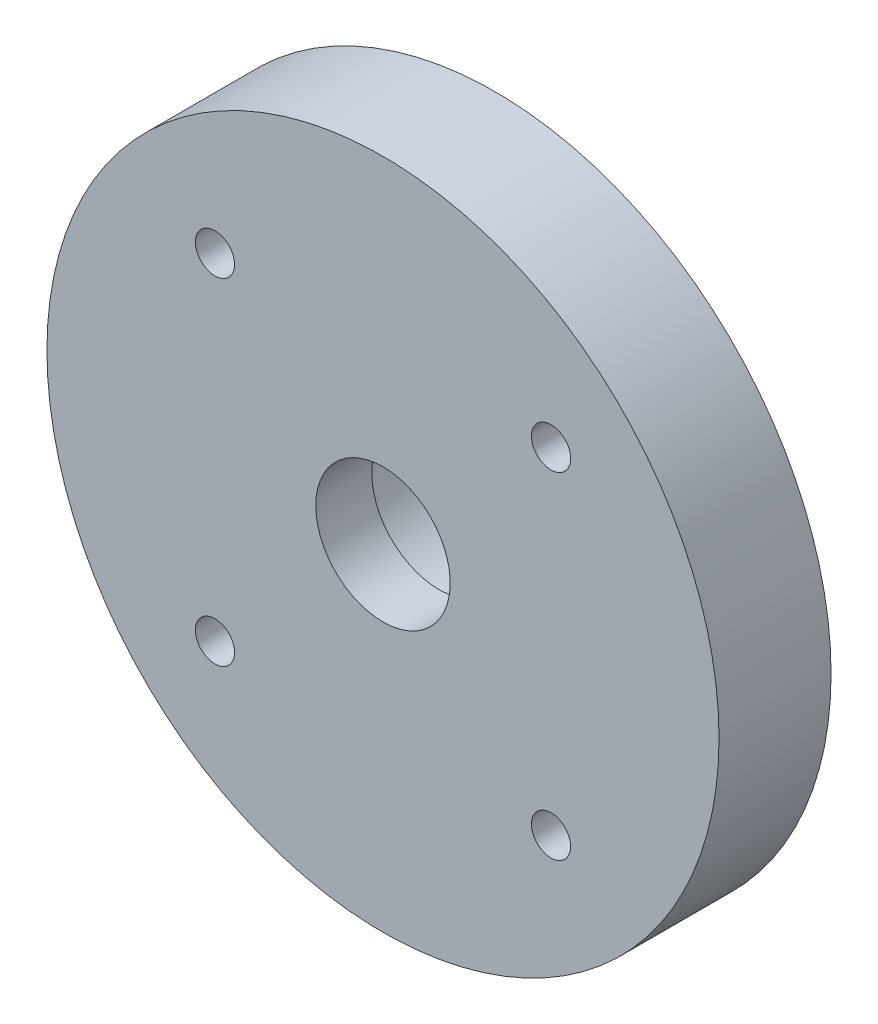
ISO-10303-21;
HEADER;
FILE_DESCRIPTION(('STEP AP214'),'2;1');
FILE_NAME('part.step','',(''),(''),'','','');
FILE_SCHEMA(('AUTOMOTIVE_DESIGN { 1 0 10303 214 1 1 1 1 }'));
ENDSEC;
DATA;
#1=APPLICATION_CONTEXT('core data for automotive mechanical design processes');
#2=APPLICATION_PROTOCOL_DEFINITION('international standard','automotive_design',2000,#1);
#3=PRODUCT_CONTEXT('',#1,'mechanical');
#4=PRODUCT('Part','Part','',(#3));
#5=PRODUCT_RELATED_PRODUCT_CATEGORY('part','',(#4));
#6=PRODUCT_DEFINITION_FORMATION('','',#4);
#7=PRODUCT_DEFINITION_CONTEXT('part definition',#1,'design');
#8=PRODUCT_DEFINITION('design','',#6,#7);
#9=PRODUCT_DEFINITION_SHAPE('','',#8);
#10=(LENGTH_UNIT() NAMED_UNIT(*) SI_UNIT(.MILLI.,.METRE.));
#11=(NAMED_UNIT(*) PLANE_ANGLE_UNIT() SI_UNIT($,.RADIAN.));
#12=(NAMED_UNIT(*) SI_UNIT($,.STERADIAN.) SOLID_ANGLE_UNIT());
#13=UNCERTAINTY_MEASURE_WITH_UNIT(LENGTH_MEASURE(1.E-05),#10,'distance_accuracy_value','');
#14=(GEOMETRIC_REPRESENTATION_CONTEXT(3) GLOBAL_UNCERTAINTY_ASSIGNED_CONTEXT((#13)) GLOBAL_UNIT_ASSIGNED_CONTEXT((#10,
#11,#12)) REPRESENTATION_CONTEXT('',''));
#15=CARTESIAN_POINT('',(0.,0.,0.));
#16=DIRECTION('',(0.,0.,1.));
#17=DIRECTION('',(1.,0.,0.));
#18=AXIS2_PLACEMENT_3D('',#15,#16,#17);
#19=CARTESIAN_POINT('',(-15.,-15.,10.));
#20=DIRECTION('',(0.,0.,-1.));
#21=DIRECTION('',(-1.,0.,0.));
#22=AXIS2_PLACEMENT_3D('',#19,#20,#21);
#23=CYLINDRICAL_SURFACE('',#22,1.75);
#24=CARTESIAN_POINT('',(-15.,-15.,10.));
#25=DIRECTION('',(0.,0.,-1.));
#26=DIRECTION('',(-1.,0.,0.));
#27=AXIS2_PLACEMENT_3D('',#24,#25,#26);
#28=CIRCLE('',#27,1.75);
#29=CARTESIAN_POINT('',(-16.75,-15.,10.));
#30=VERTEX_POINT('',#29);
#31=EDGE_CURVE('E399',#30,#30,#28,.T.);
#32=ORIENTED_EDGE('',*,*,#31,.F.);
#33=EDGE_LOOP('',(#32));
#34=FACE_BOUND('',#33,.T.);
#35=CARTESIAN_POINT('',(-15.,-15.,2.));
#36=DIRECTION('',(0.,0.,-1.));
#37=DIRECTION('',(-1.,0.,0.));
#38=AXIS2_PLACEMENT_3D('',#35,#36,#37);
#39=CIRCLE('',#38,1.75);
#40=CARTESIAN_POINT('',(-16.75,-15.,2.));
#41=VERTEX_POINT('',#40);
#42=EDGE_CURVE('E288',#41,#41,#39,.F.);
#43=ORIENTED_EDGE('',*,*,#42,.F.);
#44=EDGE_LOOP('',(#43));
#45=FACE_BOUND('',#44,.T.);
#46=ADVANCED_FACE('F33',(#34,#45),#23,.F.);
#47=CARTESIAN_POINT('',(15.,15.,10.));
#48=DIRECTION('',(0.,0.,-1.));
#49=DIRECTION('',(-1.,0.,0.));
#50=AXIS2_PLACEMENT_3D('',#47,#48,#49);
#51=CYLINDRICAL_SURFACE('',#50,1.75);
#52=CARTESIAN_POINT('',(15.,15.,10.));
#53=DIRECTION('',(0.,0.,-1.));
#54=DIRECTION('',(-1.,0.,0.));
#55=AXIS2_PLACEMENT_3D('',#52,#53,#54);
#56=CIRCLE('',#55,1.75);
#57=CARTESIAN_POINT('',(13.25,15.,10.));
#58=VERTEX_POINT('',#57);
#59=EDGE_CURVE('E405',#58,#58,#56,.T.);
#60=ORIENTED_EDGE('',*,*,#59,.F.);
#61=EDGE_LOOP('',(#60));
#62=FACE_BOUND('',#61,.T.);
#63=CARTESIAN_POINT('',(15.,15.,2.));
#64=DIRECTION('',(0.,0.,-1.));
#65=DIRECTION('',(-1.,0.,0.));
#66=AXIS2_PLACEMENT_3D('',#63,#64,#65);
#67=CIRCLE('',#66,1.75);
#68=CARTESIAN_POINT('',(13.25,15.,2.));
#69=VERTEX_POINT('',#68);
#70=EDGE_CURVE('E385',#69,#69,#67,.F.);
#71=ORIENTED_EDGE('',*,*,#70,.F.);
#72=EDGE_LOOP('',(#71));
#73=FACE_BOUND('',#72,.T.);
#74=ADVANCED_FACE('F431',(#62,#73),#51,.F.);
#75=CARTESIAN_POINT('',(0.,0.,10.));
#76=DIRECTION('',(0.,0.,-1.));
#77=DIRECTION('',(-1.,0.,0.));
#78=AXIS2_PLACEMENT_3D('',#75,#76,#77);
#79=CYLINDRICAL_SURFACE('',#78,6.);
#80=CARTESIAN_POINT('',(0.,0.,10.));
#81=DIRECTION('',(0.,0.,-1.));
#82=DIRECTION('',(-1.,0.,0.));
#83=AXIS2_PLACEMENT_3D('',#80,#81,#82);
#84=CIRCLE('',#83,6.);
#85=CARTESIAN_POINT('',(-6.,0.,10.));
#86=VERTEX_POINT('',#85);
#87=EDGE_CURVE('E415',#86,#86,#84,.T.);
#88=ORIENTED_EDGE('',*,*,#87,.F.);
#89=EDGE_LOOP('',(#88));
#90=FACE_BOUND('',#89,.T.);
#91=CARTESIAN_POINT('',(0.,0.,5.));
#92=DIRECTION('',(0.,0.,-1.));
#93=DIRECTION('',(-1.,0.,0.));
#94=AXIS2_PLACEMENT_3D('',#91,#92,#93);
#95=CIRCLE('',#94,6.);
#96=CARTESIAN_POINT('',(-6.,0.,5.));
#97=VERTEX_POINT('',#96);
#98=EDGE_CURVE('E412',#97,#97,#95,.F.);
#99=ORIENTED_EDGE('',*,*,#98,.F.);
#100=EDGE_LOOP('',(#99));
#101=FACE_BOUND('',#100,.T.);
#102=ADVANCED_FACE('F438',(#90,#101),#79,.F.);
#103=CARTESIAN_POINT('',(0.,0.,10.));
#104=DIRECTION('',(0.,0.,-1.));
#105=DIRECTION('',(-1.,0.,0.));
#106=AXIS2_PLACEMENT_3D('',#103,#104,#105);
#107=CYLINDRICAL_SURFACE('',#106,30.);
#108=CARTESIAN_POINT('',(0.,0.,10.));
#109=DIRECTION('',(0.,0.,1.));
#110=DIRECTION('',(1.,0.,0.));
#111=AXIS2_PLACEMENT_3D('',#108,#109,#110);
#112=CIRCLE('',#111,30.);
#113=CARTESIAN_POINT('',(30.,0.,10.));
#114=VERTEX_POINT('',#113);
#115=EDGE_CURVE('E11',#114,#114,#112,.T.);
#116=ORIENTED_EDGE('',*,*,#115,.F.);
#117=EDGE_LOOP('',(#116));
#118=FACE_BOUND('',#117,.T.);
#119=CARTESIAN_POINT('',(0.,0.,0.));
#120=DIRECTION('',(0.,0.,1.));
#121=DIRECTION('',(1.,0.,0.));
#122=AXIS2_PLACEMENT_3D('',#119,#120,#121);
#123=CIRCLE('',#122,30.);
#124=CARTESIAN_POINT('',(30.,0.,0.));
#125=VERTEX_POINT('',#124);
#126=EDGE_CURVE('E42',#125,#125,#123,.T.);
#127=ORIENTED_EDGE('',*,*,#126,.T.);
#128=EDGE_LOOP('',(#127));
#129=FACE_BOUND('',#128,.T.);
#130=ADVANCED_FACE('F35',(#118,#129),#107,.T.);
#131=CARTESIAN_POINT('',(0.,0.,10.));
#132=DIRECTION('',(0.,0.,1.));
#133=DIRECTION('',(1.,0.,0.));
#134=AXIS2_PLACEMENT_3D('',#131,#132,#133);
#135=PLANE('',#134);
#136=CARTESIAN_POINT('',(15.,-15.,10.));
#137=DIRECTION('',(0.,0.,-1.));
#138=DIRECTION('',(1.,0.,0.));
#139=AXIS2_PLACEMENT_3D('',#136,#137,#138);
#140=CIRCLE('',#139,1.75);
#141=CARTESIAN_POINT('',(16.75,-15.,10.));
#142=VERTEX_POINT('',#141);
#143=EDGE_CURVE('E396',#142,#142,#140,.T.);
#144=ORIENTED_EDGE('',*,*,#143,.T.);
#145=EDGE_LOOP('',(#144));
#146=FACE_BOUND('',#145,.T.);
#147=ORIENTED_EDGE('',*,*,#31,.T.);
#148=EDGE_LOOP('',(#147));
#149=FACE_BOUND('',#148,.T.);
#150=CARTESIAN_POINT('',(-15.,15.,10.));
#151=DIRECTION('',(0.,0.,-1.));
#152=DIRECTION('',(1.,0.,0.));
#153=AXIS2_PLACEMENT_3D('',#150,#151,#152);
#154=CIRCLE('',#153,1.75);
#155=CARTESIAN_POINT('',(-13.25,15.,10.));
#156=VERTEX_POINT('',#155);
#157=EDGE_CURVE('E402',#156,#156,#154,.T.);
#158=ORIENTED_EDGE('',*,*,#157,.T.);
#159=EDGE_LOOP('',(#158));
#160=FACE_BOUND('',#159,.T.);
#161=ORIENTED_EDGE('',*,*,#59,.T.);
#162=EDGE_LOOP('',(#161));
#163=FACE_BOUND('',#162,.T.);
#164=ORIENTED_EDGE('',*,*,#87,.T.);
#165=EDGE_LOOP('',(#164));
#166=FACE_BOUND('',#165,.T.);
#167=ORIENTED_EDGE('',*,*,#115,.T.);
#168=EDGE_LOOP('',(#167));
#169=FACE_BOUND('',#168,.T.);
#170=ADVANCED_FACE('F461',(#146,#149,#160,#163,#166,#169),#135,.T.);
#171=CARTESIAN_POINT('',(0.,0.,0.));
#172=DIRECTION('',(0.,0.,1.));
#173=DIRECTION('',(1.,0.,0.));
#174=AXIS2_PLACEMENT_3D('',#171,#172,#173);
#175=PLANE('',#174);
#176=DIRECTION('',(0.500000000000001,-0.866025403784438,0.));
#177=VECTOR('',#176,1.);
#178=CARTESIAN_POINT('',(18.2908965343809,-15.,0.));
#179=LINE('',#178,#177);
#180=CARTESIAN_POINT('',(16.6454482671904,-12.15,0.));
#181=VERTEX_POINT('',#180);
#182=CARTESIAN_POINT('',(18.2908965343809,-15.,0.));
#183=VERTEX_POINT('',#182);
#184=EDGE_CURVE('E232',#181,#183,#179,.T.);
#185=ORIENTED_EDGE('',*,*,#184,.F.);
#186=DIRECTION('',(1.,0.,0.));
#187=VECTOR('',#186,1.);
#188=CARTESIAN_POINT('',(16.6454482671904,-12.15,0.));
#189=LINE('',#188,#187);
#190=CARTESIAN_POINT('',(13.3545517328096,-12.15,0.));
#191=VERTEX_POINT('',#190);
#192=EDGE_CURVE('E50',#191,#181,#189,.T.);
#193=ORIENTED_EDGE('',*,*,#192,.F.);
#194=DIRECTION('',(0.499999999999999,0.866025403784439,0.));
#195=VECTOR('',#194,1.);
#196=CARTESIAN_POINT('',(13.3545517328096,-12.15,0.));
#197=LINE('',#196,#195);
#198=CARTESIAN_POINT('',(11.7091034656191,-15.,0.));
#199=VERTEX_POINT('',#198);
#200=EDGE_CURVE('E218',#199,#191,#197,.T.);
#201=ORIENTED_EDGE('',*,*,#200,.F.);
#202=DIRECTION('',(-0.5,0.866025403784439,0.));
#203=VECTOR('',#202,1.);
#204=CARTESIAN_POINT('',(11.7091034656191,-15.,0.));
#205=LINE('',#204,#203);
#206=CARTESIAN_POINT('',(13.3545517328096,-17.85,0.));
#207=VERTEX_POINT('',#206);
#208=EDGE_CURVE('E221',#207,#199,#205,.T.);
#209=ORIENTED_EDGE('',*,*,#208,.F.);
#210=DIRECTION('',(-1.,0.,0.));
#211=VECTOR('',#210,1.);
#212=CARTESIAN_POINT('',(13.3545517328096,-17.85,0.));
#213=LINE('',#212,#211);
#214=CARTESIAN_POINT('',(16.6454482671904,-17.85,0.));
#215=VERTEX_POINT('',#214);
#216=EDGE_CURVE('E237',#215,#207,#213,.T.);
#217=ORIENTED_EDGE('',*,*,#216,.F.);
#218=DIRECTION('',(-0.5,-0.866025403784439,0.));
#219=VECTOR('',#218,1.);
#220=CARTESIAN_POINT('',(16.6454482671904,-17.85,0.));
#221=LINE('',#220,#219);
#222=EDGE_CURVE('E234',#183,#215,#221,.T.);
#223=ORIENTED_EDGE('',*,*,#222,.F.);
#224=EDGE_LOOP('',(#185,#193,#201,#209,#217,#223));
#225=FACE_BOUND('',#224,.T.);
#226=DIRECTION('',(-0.5,-0.866025403784439,0.));
#227=VECTOR('',#226,1.);
#228=CARTESIAN_POINT('',(-11.7091034656191,-15.,0.));
#229=LINE('',#228,#227);
#230=CARTESIAN_POINT('',(-11.7091034656191,-15.,0.));
#231=VERTEX_POINT('',#230);
#232=CARTESIAN_POINT('',(-13.3545517328096,-17.85,0.));
#233=VERTEX_POINT('',#232);
#234=EDGE_CURVE('E272',#231,#233,#229,.T.);
#235=ORIENTED_EDGE('',*,*,#234,.F.);
#236=DIRECTION('',(0.499999999999999,-0.866025403784439,0.));
#237=VECTOR('',#236,1.);
#238=CARTESIAN_POINT('',(-13.3545517328096,-12.15,0.));
#239=LINE('',#238,#237);
#240=CARTESIAN_POINT('',(-13.3545517328096,-12.15,0.));
#241=VERTEX_POINT('',#240);
#242=EDGE_CURVE('E58',#241,#231,#239,.T.);
#243=ORIENTED_EDGE('',*,*,#242,.F.);
#244=DIRECTION('',(1.,0.,0.));
#245=VECTOR('',#244,1.);
#246=CARTESIAN_POINT('',(-16.6454482671904,-12.15,0.));
#247=LINE('',#246,#245);
#248=CARTESIAN_POINT('',(-16.6454482671904,-12.15,0.));
#249=VERTEX_POINT('',#248);
#250=EDGE_CURVE('E255',#249,#241,#247,.T.);
#251=ORIENTED_EDGE('',*,*,#250,.F.);
#252=DIRECTION('',(0.500000000000001,0.866025403784438,0.));
#253=VECTOR('',#252,1.);
#254=CARTESIAN_POINT('',(-18.2908965343809,-15.,0.));
#255=LINE('',#254,#253);
#256=CARTESIAN_POINT('',(-18.2908965343809,-15.,0.));
#257=VERTEX_POINT('',#256);
#258=EDGE_CURVE('E281',#257,#249,#255,.T.);
#259=ORIENTED_EDGE('',*,*,#258,.F.);
#260=DIRECTION('',(-0.5,0.866025403784439,0.));
#261=VECTOR('',#260,1.);
#262=CARTESIAN_POINT('',(-16.6454482671904,-17.85,0.));
#263=LINE('',#262,#261);
#264=CARTESIAN_POINT('',(-16.6454482671904,-17.85,0.));
#265=VERTEX_POINT('',#264);
#266=EDGE_CURVE('E278',#265,#257,#263,.T.);
#267=ORIENTED_EDGE('',*,*,#266,.F.);
#268=DIRECTION('',(-1.,0.,0.));
#269=VECTOR('',#268,1.);
#270=CARTESIAN_POINT('',(-13.3545517328096,-17.85,0.));
#271=LINE('',#270,#269);
#272=EDGE_CURVE('E275',#233,#265,#271,.T.);
#273=ORIENTED_EDGE('',*,*,#272,.F.);
#274=EDGE_LOOP('',(#235,#243,#251,#259,#267,#273));
#275=FACE_BOUND('',#274,.T.);
#276=DIRECTION('',(-0.500000000000001,0.866025403784438,0.));
#277=VECTOR('',#276,1.);
#278=CARTESIAN_POINT('',(-18.2908965343809,15.,0.));
#279=LINE('',#278,#277);
#280=CARTESIAN_POINT('',(-16.6454482671904,12.15,0.));
#281=VERTEX_POINT('',#280);
#282=CARTESIAN_POINT('',(-18.2908965343809,15.,0.));
#283=VERTEX_POINT('',#282);
#284=EDGE_CURVE('E320',#281,#283,#279,.T.);
#285=ORIENTED_EDGE('',*,*,#284,.F.);
#286=DIRECTION('',(-1.,0.,0.));
#287=VECTOR('',#286,1.);
#288=CARTESIAN_POINT('',(-16.6454482671904,12.15,0.));
#289=LINE('',#288,#287);
#290=CARTESIAN_POINT('',(-13.3545517328096,12.15,0.));
#291=VERTEX_POINT('',#290);
#292=EDGE_CURVE('E318',#291,#281,#289,.T.);
#293=ORIENTED_EDGE('',*,*,#292,.F.);
#294=DIRECTION('',(-0.499999999999999,-0.866025403784439,0.));
#295=VECTOR('',#294,1.);
#296=CARTESIAN_POINT('',(-13.3545517328096,12.15,0.));
#297=LINE('',#296,#295);
#298=CARTESIAN_POINT('',(-11.7091034656191,15.,0.));
#299=VERTEX_POINT('',#298);
#300=EDGE_CURVE('E302',#299,#291,#297,.T.);
#301=ORIENTED_EDGE('',*,*,#300,.F.);
#302=DIRECTION('',(0.5,-0.866025403784439,0.));
#303=VECTOR('',#302,1.);
#304=CARTESIAN_POINT('',(-11.7091034656191,15.,0.));
#305=LINE('',#304,#303);
#306=CARTESIAN_POINT('',(-13.3545517328096,17.85,0.));
#307=VERTEX_POINT('',#306);
#308=EDGE_CURVE('E329',#307,#299,#305,.T.);
#309=ORIENTED_EDGE('',*,*,#308,.F.);
#310=DIRECTION('',(1.,0.,0.));
#311=VECTOR('',#310,1.);
#312=CARTESIAN_POINT('',(-13.3545517328096,17.85,0.));
#313=LINE('',#312,#311);
#314=CARTESIAN_POINT('',(-16.6454482671904,17.85,0.));
#315=VERTEX_POINT('',#314);
#316=EDGE_CURVE('E326',#315,#307,#313,.T.);
#317=ORIENTED_EDGE('',*,*,#316,.F.);
#318=DIRECTION('',(0.5,0.866025403784439,0.));
#319=VECTOR('',#318,1.);
#320=CARTESIAN_POINT('',(-16.6454482671904,17.85,0.));
#321=LINE('',#320,#319);
#322=EDGE_CURVE('E323',#283,#315,#321,.T.);
#323=ORIENTED_EDGE('',*,*,#322,.F.);
#324=EDGE_LOOP('',(#285,#293,#301,#309,#317,#323));
#325=FACE_BOUND('',#324,.T.);
#326=DIRECTION('',(0.5,0.866025403784439,0.));
#327=VECTOR('',#326,1.);
#328=CARTESIAN_POINT('',(11.7091034656191,15.,0.));
#329=LINE('',#328,#327);
#330=CARTESIAN_POINT('',(11.7091034656191,15.,0.));
#331=VERTEX_POINT('',#330);
#332=CARTESIAN_POINT('',(13.3545517328096,17.85,0.));
#333=VERTEX_POINT('',#332);
#334=EDGE_CURVE('E369',#331,#333,#329,.T.);
#335=ORIENTED_EDGE('',*,*,#334,.F.);
#336=DIRECTION('',(-0.499999999999999,0.866025403784439,0.));
#337=VECTOR('',#336,1.);
#338=CARTESIAN_POINT('',(13.3545517328096,12.15,0.));
#339=LINE('',#338,#337);
#340=CARTESIAN_POINT('',(13.3545517328096,12.15,0.));
#341=VERTEX_POINT('',#340);
#342=EDGE_CURVE('E367',#341,#331,#339,.T.);
#343=ORIENTED_EDGE('',*,*,#342,.F.);
#344=DIRECTION('',(-1.,0.,0.));
#345=VECTOR('',#344,1.);
#346=CARTESIAN_POINT('',(16.6454482671904,12.15,0.));
#347=LINE('',#346,#345);
#348=CARTESIAN_POINT('',(16.6454482671904,12.15,0.));
#349=VERTEX_POINT('',#348);
#350=EDGE_CURVE('E351',#349,#341,#347,.T.);
#351=ORIENTED_EDGE('',*,*,#350,.F.);
#352=DIRECTION('',(-0.500000000000001,-0.866025403784438,0.));
#353=VECTOR('',#352,1.);
#354=CARTESIAN_POINT('',(18.2908965343809,15.,0.));
#355=LINE('',#354,#353);
#356=CARTESIAN_POINT('',(18.2908965343809,15.,0.));
#357=VERTEX_POINT('',#356);
#358=EDGE_CURVE('E378',#357,#349,#355,.T.);
#359=ORIENTED_EDGE('',*,*,#358,.F.);
#360=DIRECTION('',(0.5,-0.866025403784439,0.));
#361=VECTOR('',#360,1.);
#362=CARTESIAN_POINT('',(16.6454482671904,17.85,0.));
#363=LINE('',#362,#361);
#364=CARTESIAN_POINT('',(16.6454482671904,17.85,0.));
#365=VERTEX_POINT('',#364);
#366=EDGE_CURVE('E375',#365,#357,#363,.T.);
#367=ORIENTED_EDGE('',*,*,#366,.F.);
#368=DIRECTION('',(1.,0.,0.));
#369=VECTOR('',#368,1.);
#370=CARTESIAN_POINT('',(13.3545517328096,17.85,0.));
#371=LINE('',#370,#369);
#372=EDGE_CURVE('E372',#333,#365,#371,.T.);
#373=ORIENTED_EDGE('',*,*,#372,.F.);
#374=EDGE_LOOP('',(#335,#343,#351,#359,#367,#373));
#375=FACE_BOUND('',#374,.T.);
#376=CARTESIAN_POINT('',(0.,0.,0.));
#377=DIRECTION('',(0.,0.,-1.));
#378=DIRECTION('',(-1.,0.,0.));
#379=AXIS2_PLACEMENT_3D('',#376,#377,#378);
#380=CIRCLE('',#379,8.);
#381=CARTESIAN_POINT('',(-8.,0.,0.));
#382=VERTEX_POINT('',#381);
#383=EDGE_CURVE('E408',#382,#382,#380,.T.);
#384=ORIENTED_EDGE('',*,*,#383,.F.);
#385=EDGE_LOOP('',(#384));
#386=FACE_BOUND('',#385,.T.);
#387=ORIENTED_EDGE('',*,*,#126,.F.);
#388=EDGE_LOOP('',(#387));
#389=FACE_BOUND('',#388,.T.);
#390=ADVANCED_FACE('F454',(#225,#275,#325,#375,#386,#389),#175,.F.);
#391=CARTESIAN_POINT('',(0.,0.,5.));
#392=DIRECTION('',(0.,0.,-1.));
#393=DIRECTION('',(-1.,0.,0.));
#394=AXIS2_PLACEMENT_3D('',#391,#392,#393);
#395=PLANE('',#394);
#396=CARTESIAN_POINT('',(0.,0.,5.));
#397=DIRECTION('',(0.,0.,-1.));
#398=DIRECTION('',(-1.,0.,0.));
#399=AXIS2_PLACEMENT_3D('',#396,#397,#398);
#400=CIRCLE('',#399,8.);
#401=CARTESIAN_POINT('',(-8.,0.,5.));
#402=VERTEX_POINT('',#401);
#403=EDGE_CURVE('E409',#402,#402,#400,.T.);
#404=ORIENTED_EDGE('',*,*,#403,.T.);
#405=EDGE_LOOP('',(#404));
#406=FACE_BOUND('',#405,.T.);
#407=ORIENTED_EDGE('',*,*,#98,.T.);
#408=EDGE_LOOP('',(#407));
#409=FACE_BOUND('',#408,.T.);
#410=ADVANCED_FACE('F451',(#406,#409),#395,.T.);
#411=CARTESIAN_POINT('',(0.,0.,5.));
#412=DIRECTION('',(0.,0.,-1.));
#413=DIRECTION('',(-1.,0.,0.));
#414=AXIS2_PLACEMENT_3D('',#411,#412,#413);
#415=CYLINDRICAL_SURFACE('',#414,8.);
#416=ORIENTED_EDGE('',*,*,#403,.F.);
#417=EDGE_LOOP('',(#416));
#418=FACE_BOUND('',#417,.T.);
#419=ORIENTED_EDGE('',*,*,#383,.T.);
#420=EDGE_LOOP('',(#419));
#421=FACE_BOUND('',#420,.T.);
#422=ADVANCED_FACE('F448',(#418,#421),#415,.F.);
#423=CARTESIAN_POINT('',(-15.,15.,10.));
#424=DIRECTION('',(0.,0.,-1.));
#425=DIRECTION('',(-1.,0.,0.));
#426=AXIS2_PLACEMENT_3D('',#423,#424,#425);
#427=CYLINDRICAL_SURFACE('',#426,1.75);
#428=CARTESIAN_POINT('',(-15.,15.,2.));
#429=DIRECTION('',(0.,0.,1.));
#430=DIRECTION('',(1.,0.,0.));
#431=AXIS2_PLACEMENT_3D('',#428,#429,#430);
#432=CIRCLE('',#431,1.75);
#433=CARTESIAN_POINT('',(-13.25,15.,2.));
#434=VERTEX_POINT('',#433);
#435=EDGE_CURVE('E336',#434,#434,#432,.F.);
#436=ORIENTED_EDGE('',*,*,#435,.T.);
#437=EDGE_LOOP('',(#436));
#438=FACE_BOUND('',#437,.T.);
#439=ORIENTED_EDGE('',*,*,#157,.F.);
#440=EDGE_LOOP('',(#439));
#441=FACE_BOUND('',#440,.T.);
#442=ADVANCED_FACE('F446',(#438,#441),#427,.F.);
#443=CARTESIAN_POINT('',(15.,-15.,10.));
#444=DIRECTION('',(0.,0.,-1.));
#445=DIRECTION('',(-1.,0.,0.));
#446=AXIS2_PLACEMENT_3D('',#443,#444,#445);
#447=CYLINDRICAL_SURFACE('',#446,1.75);
#448=CARTESIAN_POINT('',(15.,-15.,2.));
#449=DIRECTION('',(0.,0.,1.));
#450=DIRECTION('',(1.,0.,0.));
#451=AXIS2_PLACEMENT_3D('',#448,#449,#450);
#452=CIRCLE('',#451,1.75);
#453=CARTESIAN_POINT('',(16.75,-15.,2.));
#454=VERTEX_POINT('',#453);
#455=EDGE_CURVE('E37',#454,#454,#452,.F.);
#456=ORIENTED_EDGE('',*,*,#455,.T.);
#457=EDGE_LOOP('',(#456));
#458=FACE_BOUND('',#457,.T.);
#459=ORIENTED_EDGE('',*,*,#143,.F.);
#460=EDGE_LOOP('',(#459));
#461=FACE_BOUND('',#460,.T.);
#462=ADVANCED_FACE('F444',(#458,#461),#447,.F.);
#463=CARTESIAN_POINT('',(0.,0.,2.));
#464=DIRECTION('',(0.,0.,-1.));
#465=DIRECTION('',(-1.,0.,0.));
#466=AXIS2_PLACEMENT_3D('',#463,#464,#465);
#467=PLANE('',#466);
#468=DIRECTION('',(-0.499999999999999,0.866025403784439,0.));
#469=VECTOR('',#468,1.);
#470=CARTESIAN_POINT('',(13.3545517328096,12.15,2.));
#471=LINE('',#470,#469);
#472=CARTESIAN_POINT('',(13.3545517328096,12.15,2.));
#473=VERTEX_POINT('',#472);
#474=CARTESIAN_POINT('',(11.7091034656191,15.,2.));
#475=VERTEX_POINT('',#474);
#476=EDGE_CURVE('E347',#473,#475,#471,.T.);
#477=ORIENTED_EDGE('',*,*,#476,.T.);
#478=DIRECTION('',(0.5,0.866025403784439,0.));
#479=VECTOR('',#478,1.);
#480=CARTESIAN_POINT('',(11.7091034656191,15.,2.));
#481=LINE('',#480,#479);
#482=CARTESIAN_POINT('',(13.3545517328096,17.85,2.));
#483=VERTEX_POINT('',#482);
#484=EDGE_CURVE('E350',#475,#483,#481,.T.);
#485=ORIENTED_EDGE('',*,*,#484,.T.);
#486=DIRECTION('',(1.,0.,0.));
#487=VECTOR('',#486,1.);
#488=CARTESIAN_POINT('',(13.3545517328096,17.85,2.));
#489=LINE('',#488,#487);
#490=CARTESIAN_POINT('',(16.6454482671904,17.85,2.));
#491=VERTEX_POINT('',#490);
#492=EDGE_CURVE('E354',#483,#491,#489,.T.);
#493=ORIENTED_EDGE('',*,*,#492,.T.);
#494=DIRECTION('',(0.5,-0.866025403784439,0.));
#495=VECTOR('',#494,1.);
#496=CARTESIAN_POINT('',(16.6454482671904,17.85,2.));
#497=LINE('',#496,#495);
#498=CARTESIAN_POINT('',(18.2908965343809,15.,2.));
#499=VERTEX_POINT('',#498);
#500=EDGE_CURVE('E357',#491,#499,#497,.T.);
#501=ORIENTED_EDGE('',*,*,#500,.T.);
#502=DIRECTION('',(-0.500000000000001,-0.866025403784438,0.));
#503=VECTOR('',#502,1.);
#504=CARTESIAN_POINT('',(18.2908965343809,15.,2.));
#505=LINE('',#504,#503);
#506=CARTESIAN_POINT('',(16.6454482671904,12.15,2.));
#507=VERTEX_POINT('',#506);
#508=EDGE_CURVE('E360',#499,#507,#505,.T.);
#509=ORIENTED_EDGE('',*,*,#508,.T.);
#510=DIRECTION('',(-1.,0.,0.));
#511=VECTOR('',#510,1.);
#512=CARTESIAN_POINT('',(16.6454482671904,12.15,2.));
#513=LINE('',#512,#511);
#514=EDGE_CURVE('E363',#507,#473,#513,.T.);
#515=ORIENTED_EDGE('',*,*,#514,.T.);
#516=EDGE_LOOP('',(#477,#485,#493,#501,#509,#515));
#517=FACE_BOUND('',#516,.T.);
#518=ORIENTED_EDGE('',*,*,#70,.T.);
#519=EDGE_LOOP('',(#518));
#520=FACE_BOUND('',#519,.T.);
#521=ADVANCED_FACE('F530',(#517,#520),#467,.T.);
#522=CARTESIAN_POINT('',(13.3545517328096,12.15,2.));
#523=DIRECTION('',(-0.866025403784439,-0.5,0.));
#524=DIRECTION('',(0.499999999999999,-0.866025403784439,0.));
#525=AXIS2_PLACEMENT_3D('',#522,#523,#524);
#526=PLANE('',#525);
#527=ORIENTED_EDGE('',*,*,#342,.T.);
#528=DIRECTION('',(0.,0.,-1.));
#529=VECTOR('',#528,1.);
#530=CARTESIAN_POINT('',(11.7091034656191,15.,2.));
#531=LINE('',#530,#529);
#532=EDGE_CURVE('E366',#475,#331,#531,.T.);
#533=ORIENTED_EDGE('',*,*,#532,.F.);
#534=ORIENTED_EDGE('',*,*,#476,.F.);
#535=DIRECTION('',(0.,0.,-1.));
#536=VECTOR('',#535,1.);
#537=CARTESIAN_POINT('',(13.3545517328096,12.15,2.));
#538=LINE('',#537,#536);
#539=EDGE_CURVE('E383',#473,#341,#538,.T.);
#540=ORIENTED_EDGE('',*,*,#539,.T.);
#541=EDGE_LOOP('',(#527,#533,#534,#540));
#542=FACE_BOUND('',#541,.T.);
#543=ADVANCED_FACE('F546',(#542),#526,.F.);
#544=CARTESIAN_POINT('',(16.6454482671904,12.15,2.));
#545=DIRECTION('',(0.,-1.,0.));
#546=DIRECTION('',(1.,0.,0.));
#547=AXIS2_PLACEMENT_3D('',#544,#545,#546);
#548=PLANE('',#547);
#549=ORIENTED_EDGE('',*,*,#350,.T.);
#550=ORIENTED_EDGE('',*,*,#539,.F.);
#551=ORIENTED_EDGE('',*,*,#514,.F.);
#552=DIRECTION('',(0.,0.,-1.));
#553=VECTOR('',#552,1.);
#554=CARTESIAN_POINT('',(16.6454482671904,12.15,2.));
#555=LINE('',#554,#553);
#556=EDGE_CURVE('E386',#507,#349,#555,.T.);
#557=ORIENTED_EDGE('',*,*,#556,.T.);
#558=EDGE_LOOP('',(#549,#550,#551,#557));
#559=FACE_BOUND('',#558,.T.);
#560=ADVANCED_FACE('F555',(#559),#548,.F.);
#561=CARTESIAN_POINT('',(18.2908965343809,15.,2.));
#562=DIRECTION('',(0.866025403784438,-0.500000000000001,0.));
#563=DIRECTION('',(0.500000000000001,0.866025403784438,0.));
#564=AXIS2_PLACEMENT_3D('',#561,#562,#563);
#565=PLANE('',#564);
#566=ORIENTED_EDGE('',*,*,#358,.T.);
#567=ORIENTED_EDGE('',*,*,#556,.F.);
#568=ORIENTED_EDGE('',*,*,#508,.F.);
#569=DIRECTION('',(0.,0.,-1.));
#570=VECTOR('',#569,1.);
#571=CARTESIAN_POINT('',(18.2908965343809,15.,2.));
#572=LINE('',#571,#570);
#573=EDGE_CURVE('E388',#499,#357,#572,.T.);
#574=ORIENTED_EDGE('',*,*,#573,.T.);
#575=EDGE_LOOP('',(#566,#567,#568,#574));
#576=FACE_BOUND('',#575,.T.);
#577=ADVANCED_FACE('F563',(#576),#565,.F.);
#578=CARTESIAN_POINT('',(16.6454482671904,17.85,2.));
#579=DIRECTION('',(0.866025403784439,0.5,0.));
#580=DIRECTION('',(-0.5,0.866025403784439,0.));
#581=AXIS2_PLACEMENT_3D('',#578,#579,#580);
#582=PLANE('',#581);
#583=ORIENTED_EDGE('',*,*,#366,.T.);
#584=ORIENTED_EDGE('',*,*,#573,.F.);
#585=ORIENTED_EDGE('',*,*,#500,.F.);
#586=DIRECTION('',(0.,0.,-1.));
#587=VECTOR('',#586,1.);
#588=CARTESIAN_POINT('',(16.6454482671904,17.85,2.));
#589=LINE('',#588,#587);
#590=EDGE_CURVE('E390',#491,#365,#589,.T.);
#591=ORIENTED_EDGE('',*,*,#590,.T.);
#592=EDGE_LOOP('',(#583,#584,#585,#591));
#593=FACE_BOUND('',#592,.T.);
#594=ADVANCED_FACE('F572',(#593),#582,.F.);
#595=CARTESIAN_POINT('',(13.3545517328096,17.85,2.));
#596=DIRECTION('',(0.,1.,0.));
#597=DIRECTION('',(0.,0.,1.));
#598=AXIS2_PLACEMENT_3D('',#595,#596,#597);
#599=PLANE('',#598);
#600=ORIENTED_EDGE('',*,*,#372,.T.);
#601=ORIENTED_EDGE('',*,*,#590,.F.);
#602=ORIENTED_EDGE('',*,*,#492,.F.);
#603=DIRECTION('',(0.,0.,-1.));
#604=VECTOR('',#603,1.);
#605=CARTESIAN_POINT('',(13.3545517328096,17.85,2.));
#606=LINE('',#605,#604);
#607=EDGE_CURVE('E392',#483,#333,#606,.T.);
#608=ORIENTED_EDGE('',*,*,#607,.T.);
#609=EDGE_LOOP('',(#600,#601,#602,#608));
#610=FACE_BOUND('',#609,.T.);
#611=ADVANCED_FACE('F581',(#610),#599,.F.);
#612=CARTESIAN_POINT('',(11.7091034656191,15.,2.));
#613=DIRECTION('',(-0.866025403784439,0.5,0.));
#614=DIRECTION('',(-0.5,-0.866025403784439,0.));
#615=AXIS2_PLACEMENT_3D('',#612,#613,#614);
#616=PLANE('',#615);
#617=ORIENTED_EDGE('',*,*,#334,.T.);
#618=ORIENTED_EDGE('',*,*,#607,.F.);
#619=ORIENTED_EDGE('',*,*,#484,.F.);
#620=ORIENTED_EDGE('',*,*,#532,.T.);
#621=EDGE_LOOP('',(#617,#618,#619,#620));
#622=FACE_BOUND('',#621,.T.);
#623=ADVANCED_FACE('F590',(#622),#616,.F.);
#624=CARTESIAN_POINT('',(0.,0.,2.));
#625=DIRECTION('',(0.,0.,1.));
#626=DIRECTION('',(1.,0.,0.));
#627=AXIS2_PLACEMENT_3D('',#624,#625,#626);
#628=PLANE('',#627);
#629=DIRECTION('',(-1.,0.,0.));
#630=VECTOR('',#629,1.);
#631=CARTESIAN_POINT('',(-16.6454482671904,12.15,2.));
#632=LINE('',#631,#630);
#633=CARTESIAN_POINT('',(-13.3545517328096,12.15,2.));
#634=VERTEX_POINT('',#633);
#635=CARTESIAN_POINT('',(-16.6454482671904,12.15,2.));
#636=VERTEX_POINT('',#635);
#637=EDGE_CURVE('E298',#634,#636,#632,.T.);
#638=ORIENTED_EDGE('',*,*,#637,.T.);
#639=DIRECTION('',(-0.500000000000001,0.866025403784438,0.));
#640=VECTOR('',#639,1.);
#641=CARTESIAN_POINT('',(-18.2908965343809,15.,2.));
#642=LINE('',#641,#640);
#643=CARTESIAN_POINT('',(-18.2908965343809,15.,2.));
#644=VERTEX_POINT('',#643);
#645=EDGE_CURVE('E301',#636,#644,#642,.T.);
#646=ORIENTED_EDGE('',*,*,#645,.T.);
#647=DIRECTION('',(0.5,0.866025403784439,0.));
#648=VECTOR('',#647,1.);
#649=CARTESIAN_POINT('',(-16.6454482671904,17.85,2.));
#650=LINE('',#649,#648);
#651=CARTESIAN_POINT('',(-16.6454482671904,17.85,2.));
#652=VERTEX_POINT('',#651);
#653=EDGE_CURVE('E305',#644,#652,#650,.T.);
#654=ORIENTED_EDGE('',*,*,#653,.T.);
#655=DIRECTION('',(1.,0.,0.));
#656=VECTOR('',#655,1.);
#657=CARTESIAN_POINT('',(-13.3545517328096,17.85,2.));
#658=LINE('',#657,#656);
#659=CARTESIAN_POINT('',(-13.3545517328096,17.85,2.));
#660=VERTEX_POINT('',#659);
#661=EDGE_CURVE('E308',#652,#660,#658,.T.);
#662=ORIENTED_EDGE('',*,*,#661,.T.);
#663=DIRECTION('',(0.5,-0.866025403784439,0.));
#664=VECTOR('',#663,1.);
#665=CARTESIAN_POINT('',(-11.7091034656191,15.,2.));
#666=LINE('',#665,#664);
#667=CARTESIAN_POINT('',(-11.7091034656191,15.,2.));
#668=VERTEX_POINT('',#667);
#669=EDGE_CURVE('E311',#660,#668,#666,.T.);
#670=ORIENTED_EDGE('',*,*,#669,.T.);
#671=DIRECTION('',(-0.499999999999999,-0.866025403784439,0.));
#672=VECTOR('',#671,1.);
#673=CARTESIAN_POINT('',(-13.3545517328096,12.15,2.));
#674=LINE('',#673,#672);
#675=EDGE_CURVE('E314',#668,#634,#674,.T.);
#676=ORIENTED_EDGE('',*,*,#675,.T.);
#677=EDGE_LOOP('',(#638,#646,#654,#662,#670,#676));
#678=FACE_BOUND('',#677,.T.);
#679=ORIENTED_EDGE('',*,*,#435,.F.);
#680=EDGE_LOOP('',(#679));
#681=FACE_BOUND('',#680,.T.);
#682=ADVANCED_FACE('F599',(#678,#681),#628,.F.);
#683=CARTESIAN_POINT('',(-16.6454482671904,12.15,2.));
#684=DIRECTION('',(0.,-1.,0.));
#685=DIRECTION('',(1.,0.,0.));
#686=AXIS2_PLACEMENT_3D('',#683,#684,#685);
#687=PLANE('',#686);
#688=ORIENTED_EDGE('',*,*,#292,.T.);
#689=DIRECTION('',(0.,0.,-1.));
#690=VECTOR('',#689,1.);
#691=CARTESIAN_POINT('',(-16.6454482671904,12.15,2.));
#692=LINE('',#691,#690);
#693=EDGE_CURVE('E317',#636,#281,#692,.T.);
#694=ORIENTED_EDGE('',*,*,#693,.F.);
#695=ORIENTED_EDGE('',*,*,#637,.F.);
#696=DIRECTION('',(0.,0.,-1.));
#697=VECTOR('',#696,1.);
#698=CARTESIAN_POINT('',(-13.3545517328096,12.15,2.));
#699=LINE('',#698,#697);
#700=EDGE_CURVE('E334',#634,#291,#699,.T.);
#701=ORIENTED_EDGE('',*,*,#700,.T.);
#702=EDGE_LOOP('',(#688,#694,#695,#701));
#703=FACE_BOUND('',#702,.T.);
#704=ADVANCED_FACE('F608',(#703),#687,.F.);
#705=CARTESIAN_POINT('',(-13.3545517328096,12.15,2.));
#706=DIRECTION('',(0.866025403784439,-0.5,0.));
#707=DIRECTION('',(0.499999999999999,0.866025403784439,0.));
#708=AXIS2_PLACEMENT_3D('',#705,#706,#707);
#709=PLANE('',#708);
#710=ORIENTED_EDGE('',*,*,#300,.T.);
#711=ORIENTED_EDGE('',*,*,#700,.F.);
#712=ORIENTED_EDGE('',*,*,#675,.F.);
#713=DIRECTION('',(0.,0.,-1.));
#714=VECTOR('',#713,1.);
#715=CARTESIAN_POINT('',(-11.7091034656191,15.,2.));
#716=LINE('',#715,#714);
#717=EDGE_CURVE('E337',#668,#299,#716,.T.);
#718=ORIENTED_EDGE('',*,*,#717,.T.);
#719=EDGE_LOOP('',(#710,#711,#712,#718));
#720=FACE_BOUND('',#719,.T.);
#721=ADVANCED_FACE('F617',(#720),#709,.F.);
#722=CARTESIAN_POINT('',(-11.7091034656191,15.,2.));
#723=DIRECTION('',(0.866025403784439,0.5,0.));
#724=DIRECTION('',(-0.5,0.866025403784439,0.));
#725=AXIS2_PLACEMENT_3D('',#722,#723,#724);
#726=PLANE('',#725);
#727=ORIENTED_EDGE('',*,*,#308,.T.);
#728=ORIENTED_EDGE('',*,*,#717,.F.);
#729=ORIENTED_EDGE('',*,*,#669,.F.);
#730=DIRECTION('',(0.,0.,-1.));
#731=VECTOR('',#730,1.);
#732=CARTESIAN_POINT('',(-13.3545517328096,17.85,2.));
#733=LINE('',#732,#731);
#734=EDGE_CURVE('E339',#660,#307,#733,.T.);
#735=ORIENTED_EDGE('',*,*,#734,.T.);
#736=EDGE_LOOP('',(#727,#728,#729,#735));
#737=FACE_BOUND('',#736,.T.);
#738=ADVANCED_FACE('F626',(#737),#726,.F.);
#739=CARTESIAN_POINT('',(-13.3545517328096,17.85,2.));
#740=DIRECTION('',(0.,1.,0.));
#741=DIRECTION('',(0.,0.,1.));
#742=AXIS2_PLACEMENT_3D('',#739,#740,#741);
#743=PLANE('',#742);
#744=ORIENTED_EDGE('',*,*,#316,.T.);
#745=ORIENTED_EDGE('',*,*,#734,.F.);
#746=ORIENTED_EDGE('',*,*,#661,.F.);
#747=DIRECTION('',(0.,0.,-1.));
#748=VECTOR('',#747,1.);
#749=CARTESIAN_POINT('',(-16.6454482671904,17.85,2.));
#750=LINE('',#749,#748);
#751=EDGE_CURVE('E341',#652,#315,#750,.T.);
#752=ORIENTED_EDGE('',*,*,#751,.T.);
#753=EDGE_LOOP('',(#744,#745,#746,#752));
#754=FACE_BOUND('',#753,.T.);
#755=ADVANCED_FACE('F635',(#754),#743,.F.);
#756=CARTESIAN_POINT('',(-16.6454482671904,17.85,2.));
#757=DIRECTION('',(-0.866025403784439,0.5,0.));
#758=DIRECTION('',(-0.5,-0.866025403784439,0.));
#759=AXIS2_PLACEMENT_3D('',#756,#757,#758);
#760=PLANE('',#759);
#761=ORIENTED_EDGE('',*,*,#322,.T.);
#762=ORIENTED_EDGE('',*,*,#751,.F.);
#763=ORIENTED_EDGE('',*,*,#653,.F.);
#764=DIRECTION('',(0.,0.,-1.));
#765=VECTOR('',#764,1.);
#766=CARTESIAN_POINT('',(-18.2908965343809,15.,2.));
#767=LINE('',#766,#765);
#768=EDGE_CURVE('E343',#644,#283,#767,.T.);
#769=ORIENTED_EDGE('',*,*,#768,.T.);
#770=EDGE_LOOP('',(#761,#762,#763,#769));
#771=FACE_BOUND('',#770,.T.);
#772=ADVANCED_FACE('F644',(#771),#760,.F.);
#773=CARTESIAN_POINT('',(-18.2908965343809,15.,2.));
#774=DIRECTION('',(-0.866025403784438,-0.500000000000001,0.));
#775=DIRECTION('',(0.500000000000001,-0.866025403784438,0.));
#776=AXIS2_PLACEMENT_3D('',#773,#774,#775);
#777=PLANE('',#776);
#778=ORIENTED_EDGE('',*,*,#284,.T.);
#779=ORIENTED_EDGE('',*,*,#768,.F.);
#780=ORIENTED_EDGE('',*,*,#645,.F.);
#781=ORIENTED_EDGE('',*,*,#693,.T.);
#782=EDGE_LOOP('',(#778,#779,#780,#781));
#783=FACE_BOUND('',#782,.T.);
#784=ADVANCED_FACE('F653',(#783),#777,.F.);
#785=CARTESIAN_POINT('',(0.,0.,2.));
#786=DIRECTION('',(0.,0.,-1.));
#787=DIRECTION('',(-1.,0.,0.));
#788=AXIS2_PLACEMENT_3D('',#785,#786,#787);
#789=PLANE('',#788);
#790=DIRECTION('',(0.499999999999999,-0.866025403784439,0.));
#791=VECTOR('',#790,1.);
#792=CARTESIAN_POINT('',(-13.3545517328096,-12.15,2.));
#793=LINE('',#792,#791);
#794=CARTESIAN_POINT('',(-13.3545517328096,-12.15,2.));
#795=VERTEX_POINT('',#794);
#796=CARTESIAN_POINT('',(-11.7091034656191,-15.,2.));
#797=VERTEX_POINT('',#796);
#798=EDGE_CURVE('E251',#795,#797,#793,.T.);
#799=ORIENTED_EDGE('',*,*,#798,.T.);
#800=DIRECTION('',(-0.5,-0.866025403784439,0.));
#801=VECTOR('',#800,1.);
#802=CARTESIAN_POINT('',(-11.7091034656191,-15.,2.));
#803=LINE('',#802,#801);
#804=CARTESIAN_POINT('',(-13.3545517328096,-17.85,2.));
#805=VERTEX_POINT('',#804);
#806=EDGE_CURVE('E254',#797,#805,#803,.T.);
#807=ORIENTED_EDGE('',*,*,#806,.T.);
#808=DIRECTION('',(-1.,0.,0.));
#809=VECTOR('',#808,1.);
#810=CARTESIAN_POINT('',(-13.3545517328096,-17.85,2.));
#811=LINE('',#810,#809);
#812=CARTESIAN_POINT('',(-16.6454482671904,-17.85,2.));
#813=VERTEX_POINT('',#812);
#814=EDGE_CURVE('E258',#805,#813,#811,.T.);
#815=ORIENTED_EDGE('',*,*,#814,.T.);
#816=DIRECTION('',(-0.5,0.866025403784439,0.));
#817=VECTOR('',#816,1.);
#818=CARTESIAN_POINT('',(-16.6454482671904,-17.85,2.));
#819=LINE('',#818,#817);
#820=CARTESIAN_POINT('',(-18.2908965343809,-15.,2.));
#821=VERTEX_POINT('',#820);
#822=EDGE_CURVE('E261',#813,#821,#819,.T.);
#823=ORIENTED_EDGE('',*,*,#822,.T.);
#824=DIRECTION('',(0.500000000000001,0.866025403784438,0.));
#825=VECTOR('',#824,1.);
#826=CARTESIAN_POINT('',(-18.2908965343809,-15.,2.));
#827=LINE('',#826,#825);
#828=CARTESIAN_POINT('',(-16.6454482671904,-12.15,2.));
#829=VERTEX_POINT('',#828);
#830=EDGE_CURVE('E264',#821,#829,#827,.T.);
#831=ORIENTED_EDGE('',*,*,#830,.T.);
#832=DIRECTION('',(1.,0.,0.));
#833=VECTOR('',#832,1.);
#834=CARTESIAN_POINT('',(-16.6454482671904,-12.15,2.));
#835=LINE('',#834,#833);
#836=EDGE_CURVE('E267',#829,#795,#835,.T.);
#837=ORIENTED_EDGE('',*,*,#836,.T.);
#838=EDGE_LOOP('',(#799,#807,#815,#823,#831,#837));
#839=FACE_BOUND('',#838,.T.);
#840=ORIENTED_EDGE('',*,*,#42,.T.);
#841=EDGE_LOOP('',(#840));
#842=FACE_BOUND('',#841,.T.);
#843=ADVANCED_FACE('F428',(#839,#842),#789,.T.);
#844=CARTESIAN_POINT('',(-13.3545517328096,-12.15,2.));
#845=DIRECTION('',(0.866025403784439,0.5,0.));
#846=DIRECTION('',(-0.499999999999999,0.866025403784439,0.));
#847=AXIS2_PLACEMENT_3D('',#844,#845,#846);
#848=PLANE('',#847);
#849=ORIENTED_EDGE('',*,*,#242,.T.);
#850=DIRECTION('',(0.,0.,-1.));
#851=VECTOR('',#850,1.);
#852=CARTESIAN_POINT('',(-11.7091034656191,-15.,2.));
#853=LINE('',#852,#851);
#854=EDGE_CURVE('E270',#797,#231,#853,.T.);
#855=ORIENTED_EDGE('',*,*,#854,.F.);
#856=ORIENTED_EDGE('',*,*,#798,.F.);
#857=DIRECTION('',(0.,0.,-1.));
#858=VECTOR('',#857,1.);
#859=CARTESIAN_POINT('',(-13.3545517328096,-12.15,2.));
#860=LINE('',#859,#858);
#861=EDGE_CURVE('E286',#795,#241,#860,.T.);
#862=ORIENTED_EDGE('',*,*,#861,.T.);
#863=EDGE_LOOP('',(#849,#855,#856,#862));
#864=FACE_BOUND('',#863,.T.);
#865=ADVANCED_FACE('F670',(#864),#848,.F.);
#866=CARTESIAN_POINT('',(-16.6454482671904,-12.15,2.));
#867=DIRECTION('',(0.,1.,0.));
#868=DIRECTION('',(-1.,0.,0.));
#869=AXIS2_PLACEMENT_3D('',#866,#867,#868);
#870=PLANE('',#869);
#871=ORIENTED_EDGE('',*,*,#250,.T.);
#872=ORIENTED_EDGE('',*,*,#861,.F.);
#873=ORIENTED_EDGE('',*,*,#836,.F.);
#874=DIRECTION('',(0.,0.,-1.));
#875=VECTOR('',#874,1.);
#876=CARTESIAN_POINT('',(-16.6454482671904,-12.15,2.));
#877=LINE('',#876,#875);
#878=EDGE_CURVE('E289',#829,#249,#877,.T.);
#879=ORIENTED_EDGE('',*,*,#878,.T.);
#880=EDGE_LOOP('',(#871,#872,#873,#879));
#881=FACE_BOUND('',#880,.T.);
#882=ADVANCED_FACE('F679',(#881),#870,.F.);
#883=CARTESIAN_POINT('',(-18.2908965343809,-15.,2.));
#884=DIRECTION('',(-0.866025403784438,0.500000000000001,0.));
#885=DIRECTION('',(-0.500000000000001,-0.866025403784438,0.));
#886=AXIS2_PLACEMENT_3D('',#883,#884,#885);
#887=PLANE('',#886);
#888=ORIENTED_EDGE('',*,*,#258,.T.);
#889=ORIENTED_EDGE('',*,*,#878,.F.);
#890=ORIENTED_EDGE('',*,*,#830,.F.);
#891=DIRECTION('',(0.,0.,-1.));
#892=VECTOR('',#891,1.);
#893=CARTESIAN_POINT('',(-18.2908965343809,-15.,2.));
#894=LINE('',#893,#892);
#895=EDGE_CURVE('E291',#821,#257,#894,.T.);
#896=ORIENTED_EDGE('',*,*,#895,.T.);
#897=EDGE_LOOP('',(#888,#889,#890,#896));
#898=FACE_BOUND('',#897,.T.);
#899=ADVANCED_FACE('F687',(#898),#887,.F.);
#900=CARTESIAN_POINT('',(-16.6454482671904,-17.85,2.));
#901=DIRECTION('',(-0.866025403784439,-0.5,0.));
#902=DIRECTION('',(0.5,-0.866025403784439,0.));
#903=AXIS2_PLACEMENT_3D('',#900,#901,#902);
#904=PLANE('',#903);
#905=ORIENTED_EDGE('',*,*,#266,.T.);
#906=ORIENTED_EDGE('',*,*,#895,.F.);
#907=ORIENTED_EDGE('',*,*,#822,.F.);
#908=DIRECTION('',(0.,0.,-1.));
#909=VECTOR('',#908,1.);
#910=CARTESIAN_POINT('',(-16.6454482671904,-17.85,2.));
#911=LINE('',#910,#909);
#912=EDGE_CURVE('E293',#813,#265,#911,.T.);
#913=ORIENTED_EDGE('',*,*,#912,.T.);
#914=EDGE_LOOP('',(#905,#906,#907,#913));
#915=FACE_BOUND('',#914,.T.);
#916=ADVANCED_FACE('F696',(#915),#904,.F.);
#917=CARTESIAN_POINT('',(-13.3545517328096,-17.85,2.));
#918=DIRECTION('',(0.,-1.,0.));
#919=DIRECTION('',(0.,0.,-1.));
#920=AXIS2_PLACEMENT_3D('',#917,#918,#919);
#921=PLANE('',#920);
#922=ORIENTED_EDGE('',*,*,#272,.T.);
#923=ORIENTED_EDGE('',*,*,#912,.F.);
#924=ORIENTED_EDGE('',*,*,#814,.F.);
#925=DIRECTION('',(0.,0.,-1.));
#926=VECTOR('',#925,1.);
#927=CARTESIAN_POINT('',(-13.3545517328096,-17.85,2.));
#928=LINE('',#927,#926);
#929=EDGE_CURVE('E295',#805,#233,#928,.T.);
#930=ORIENTED_EDGE('',*,*,#929,.T.);
#931=EDGE_LOOP('',(#922,#923,#924,#930));
#932=FACE_BOUND('',#931,.T.);
#933=ADVANCED_FACE('F705',(#932),#921,.F.);
#934=CARTESIAN_POINT('',(-11.7091034656191,-15.,2.));
#935=DIRECTION('',(0.866025403784439,-0.5,0.));
#936=DIRECTION('',(0.5,0.866025403784439,0.));
#937=AXIS2_PLACEMENT_3D('',#934,#935,#936);
#938=PLANE('',#937);
#939=ORIENTED_EDGE('',*,*,#234,.T.);
#940=ORIENTED_EDGE('',*,*,#929,.F.);
#941=ORIENTED_EDGE('',*,*,#806,.F.);
#942=ORIENTED_EDGE('',*,*,#854,.T.);
#943=EDGE_LOOP('',(#939,#940,#941,#942));
#944=FACE_BOUND('',#943,.T.);
#945=ADVANCED_FACE('F714',(#944),#938,.F.);
#946=CARTESIAN_POINT('',(0.,0.,2.));
#947=DIRECTION('',(0.,0.,1.));
#948=DIRECTION('',(1.,0.,0.));
#949=AXIS2_PLACEMENT_3D('',#946,#947,#948);
#950=PLANE('',#949);
#951=DIRECTION('',(1.,0.,0.));
#952=VECTOR('',#951,1.);
#953=CARTESIAN_POINT('',(16.6454482671904,-12.15,2.));
#954=LINE('',#953,#952);
#955=CARTESIAN_POINT('',(13.3545517328096,-12.15,2.));
#956=VERTEX_POINT('',#955);
#957=CARTESIAN_POINT('',(16.6454482671904,-12.15,2.));
#958=VERTEX_POINT('',#957);
#959=EDGE_CURVE('E198',#956,#958,#954,.T.);
#960=ORIENTED_EDGE('',*,*,#959,.T.);
#961=DIRECTION('',(0.500000000000001,-0.866025403784438,0.));
#962=VECTOR('',#961,1.);
#963=CARTESIAN_POINT('',(18.2908965343809,-15.,2.));
#964=LINE('',#963,#962);
#965=CARTESIAN_POINT('',(18.2908965343809,-15.,2.));
#966=VERTEX_POINT('',#965);
#967=EDGE_CURVE('E207',#958,#966,#964,.T.);
#968=ORIENTED_EDGE('',*,*,#967,.T.);
#969=DIRECTION('',(-0.5,-0.866025403784439,0.));
#970=VECTOR('',#969,1.);
#971=CARTESIAN_POINT('',(16.6454482671904,-17.85,2.));
#972=LINE('',#971,#970);
#973=CARTESIAN_POINT('',(16.6454482671904,-17.85,2.));
#974=VERTEX_POINT('',#973);
#975=EDGE_CURVE('E212',#966,#974,#972,.T.);
#976=ORIENTED_EDGE('',*,*,#975,.T.);
#977=DIRECTION('',(-1.,0.,0.));
#978=VECTOR('',#977,1.);
#979=CARTESIAN_POINT('',(13.3545517328096,-17.85,2.));
#980=LINE('',#979,#978);
#981=CARTESIAN_POINT('',(13.3545517328096,-17.85,2.));
#982=VERTEX_POINT('',#981);
#983=EDGE_CURVE('E225',#974,#982,#980,.T.);
#984=ORIENTED_EDGE('',*,*,#983,.T.);
#985=DIRECTION('',(-0.5,0.866025403784439,0.));
#986=VECTOR('',#985,1.);
#987=CARTESIAN_POINT('',(11.7091034656191,-15.,2.));
#988=LINE('',#987,#986);
#989=CARTESIAN_POINT('',(11.7091034656191,-15.,2.));
#990=VERTEX_POINT('',#989);
#991=EDGE_CURVE('E228',#982,#990,#988,.T.);
#992=ORIENTED_EDGE('',*,*,#991,.T.);
#993=DIRECTION('',(0.499999999999999,0.866025403784439,0.));
#994=VECTOR('',#993,1.);
#995=CARTESIAN_POINT('',(13.3545517328096,-12.15,2.));
#996=LINE('',#995,#994);
#997=EDGE_CURVE('E204',#990,#956,#996,.T.);
#998=ORIENTED_EDGE('',*,*,#997,.T.);
#999=EDGE_LOOP('',(#960,#968,#976,#984,#992,#998));
#1000=FACE_BOUND('',#999,.T.);
#1001=ORIENTED_EDGE('',*,*,#455,.F.);
#1002=EDGE_LOOP('',(#1001));
#1003=FACE_BOUND('',#1002,.T.);
#1004=ADVANCED_FACE('F214',(#1000,#1003),#950,.F.);
#1005=CARTESIAN_POINT('',(16.6454482671904,-12.15,2.));
#1006=DIRECTION('',(0.,1.,0.));
#1007=DIRECTION('',(-1.,0.,0.));
#1008=AXIS2_PLACEMENT_3D('',#1005,#1006,#1007);
#1009=PLANE('',#1008);
#1010=ORIENTED_EDGE('',*,*,#192,.T.);
#1011=DIRECTION('',(0.,0.,-1.));
#1012=VECTOR('',#1011,1.);
#1013=CARTESIAN_POINT('',(16.6454482671904,-12.15,2.));
#1014=LINE('',#1013,#1012);
#1015=EDGE_CURVE('E194',#958,#181,#1014,.T.);
#1016=ORIENTED_EDGE('',*,*,#1015,.F.);
#1017=ORIENTED_EDGE('',*,*,#959,.F.);
#1018=DIRECTION('',(0.,0.,-1.));
#1019=VECTOR('',#1018,1.);
#1020=CARTESIAN_POINT('',(13.3545517328096,-12.15,2.));
#1021=LINE('',#1020,#1019);
#1022=EDGE_CURVE('E242',#956,#191,#1021,.T.);
#1023=ORIENTED_EDGE('',*,*,#1022,.T.);
#1024=EDGE_LOOP('',(#1010,#1016,#1017,#1023));
#1025=FACE_BOUND('',#1024,.T.);
#1026=ADVANCED_FACE('F196',(#1025),#1009,.F.);
#1027=CARTESIAN_POINT('',(13.3545517328096,-12.15,2.));
#1028=DIRECTION('',(-0.866025403784439,0.5,0.));
#1029=DIRECTION('',(-0.499999999999999,-0.866025403784439,0.));
#1030=AXIS2_PLACEMENT_3D('',#1027,#1028,#1029);
#1031=PLANE('',#1030);
#1032=ORIENTED_EDGE('',*,*,#200,.T.);
#1033=ORIENTED_EDGE('',*,*,#1022,.F.);
#1034=ORIENTED_EDGE('',*,*,#997,.F.);
#1035=DIRECTION('',(0.,0.,-1.));
#1036=VECTOR('',#1035,1.);
#1037=CARTESIAN_POINT('',(11.7091034656191,-15.,2.));
#1038=LINE('',#1037,#1036);
#1039=EDGE_CURVE('E244',#990,#199,#1038,.T.);
#1040=ORIENTED_EDGE('',*,*,#1039,.T.);
#1041=EDGE_LOOP('',(#1032,#1033,#1034,#1040));
#1042=FACE_BOUND('',#1041,.T.);
#1043=ADVANCED_FACE('F738',(#1042),#1031,.F.);
#1044=CARTESIAN_POINT('',(11.7091034656191,-15.,2.));
#1045=DIRECTION('',(-0.866025403784439,-0.5,0.));
#1046=DIRECTION('',(0.5,-0.866025403784439,0.));
#1047=AXIS2_PLACEMENT_3D('',#1044,#1045,#1046);
#1048=PLANE('',#1047);
#1049=ORIENTED_EDGE('',*,*,#208,.T.);
#1050=ORIENTED_EDGE('',*,*,#1039,.F.);
#1051=ORIENTED_EDGE('',*,*,#991,.F.);
#1052=DIRECTION('',(0.,0.,-1.));
#1053=VECTOR('',#1052,1.);
#1054=CARTESIAN_POINT('',(13.3545517328096,-17.85,2.));
#1055=LINE('',#1054,#1053);
#1056=EDGE_CURVE('E246',#982,#207,#1055,.T.);
#1057=ORIENTED_EDGE('',*,*,#1056,.T.);
#1058=EDGE_LOOP('',(#1049,#1050,#1051,#1057));
#1059=FACE_BOUND('',#1058,.T.);
#1060=ADVANCED_FACE('F746',(#1059),#1048,.F.);
#1061=CARTESIAN_POINT('',(13.3545517328096,-17.85,2.));
#1062=DIRECTION('',(0.,-1.,0.));
#1063=DIRECTION('',(0.,0.,-1.));
#1064=AXIS2_PLACEMENT_3D('',#1061,#1062,#1063);
#1065=PLANE('',#1064);
#1066=ORIENTED_EDGE('',*,*,#216,.T.);
#1067=ORIENTED_EDGE('',*,*,#1056,.F.);
#1068=ORIENTED_EDGE('',*,*,#983,.F.);
#1069=DIRECTION('',(0.,0.,-1.));
#1070=VECTOR('',#1069,1.);
#1071=CARTESIAN_POINT('',(16.6454482671904,-17.85,2.));
#1072=LINE('',#1071,#1070);
#1073=EDGE_CURVE('E248',#974,#215,#1072,.T.);
#1074=ORIENTED_EDGE('',*,*,#1073,.T.);
#1075=EDGE_LOOP('',(#1066,#1067,#1068,#1074));
#1076=FACE_BOUND('',#1075,.T.);
#1077=ADVANCED_FACE('F755',(#1076),#1065,.F.);
#1078=CARTESIAN_POINT('',(16.6454482671904,-17.85,2.));
#1079=DIRECTION('',(0.866025403784439,-0.5,0.));
#1080=DIRECTION('',(0.5,0.866025403784439,0.));
#1081=AXIS2_PLACEMENT_3D('',#1078,#1079,#1080);
#1082=PLANE('',#1081);
#1083=ORIENTED_EDGE('',*,*,#222,.T.);
#1084=ORIENTED_EDGE('',*,*,#1073,.F.);
#1085=ORIENTED_EDGE('',*,*,#975,.F.);
#1086=DIRECTION('',(0.,0.,-1.));
#1087=VECTOR('',#1086,1.);
#1088=CARTESIAN_POINT('',(18.2908965343809,-15.,2.));
#1089=LINE('',#1088,#1087);
#1090=EDGE_CURVE('E203',#966,#183,#1089,.T.);
#1091=ORIENTED_EDGE('',*,*,#1090,.T.);
#1092=EDGE_LOOP('',(#1083,#1084,#1085,#1091));
#1093=FACE_BOUND('',#1092,.T.);
#1094=ADVANCED_FACE('F764',(#1093),#1082,.F.);
#1095=CARTESIAN_POINT('',(18.2908965343809,-15.,2.));
#1096=DIRECTION('',(0.866025403784438,0.500000000000001,0.));
#1097=DIRECTION('',(-0.500000000000001,0.866025403784438,0.));
#1098=AXIS2_PLACEMENT_3D('',#1095,#1096,#1097);
#1099=PLANE('',#1098);
#1100=ORIENTED_EDGE('',*,*,#184,.T.);
#1101=ORIENTED_EDGE('',*,*,#1090,.F.);
#1102=ORIENTED_EDGE('',*,*,#967,.F.);
#1103=ORIENTED_EDGE('',*,*,#1015,.T.);
#1104=EDGE_LOOP('',(#1100,#1101,#1102,#1103));
#1105=FACE_BOUND('',#1104,.T.);
#1106=ADVANCED_FACE('F208',(#1105),#1099,.F.);
#1107=CLOSED_SHELL('',(#46,#74,#102,#130,#170,#390,#410,#422,#442,#462,#521,#543,#560,#577,#594,
#611,#623,#682,#704,#721,#738,#755,#772,#784,#843,#865,#882,#899,#916,#933,#945,#1004,#1026,
#1043,#1060,#1077,#1094,#1106));
#1108=MANIFOLD_SOLID_BREP('B2',#1107);
#1109=ADVANCED_BREP_SHAPE_REPRESENTATION('',(#18,#1108),#14);
#1110=SHAPE_DEFINITION_REPRESENTATION(#9,#1109);
ENDSEC;
END-ISO-10303-21;
